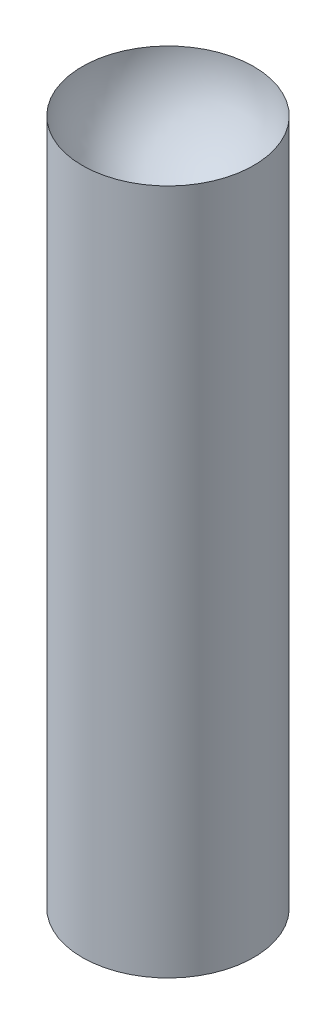
ISO-10303-21;
HEADER;
FILE_DESCRIPTION(('STEP AP214'),'2;1');
FILE_NAME('part.step','',(''),(''),'','','');
FILE_SCHEMA(('AUTOMOTIVE_DESIGN { 1 0 10303 214 1 1 1 1 }'));
ENDSEC;
DATA;
#1=APPLICATION_CONTEXT('core data for automotive mechanical design processes');
#2=APPLICATION_PROTOCOL_DEFINITION('international standard','automotive_design',2000,#1);
#3=PRODUCT_CONTEXT('',#1,'mechanical');
#4=PRODUCT('Part','Part','',(#3));
#5=PRODUCT_RELATED_PRODUCT_CATEGORY('part','',(#4));
#6=PRODUCT_DEFINITION_FORMATION('','',#4);
#7=PRODUCT_DEFINITION_CONTEXT('part definition',#1,'design');
#8=PRODUCT_DEFINITION('design','',#6,#7);
#9=PRODUCT_DEFINITION_SHAPE('','',#8);
#10=(LENGTH_UNIT() NAMED_UNIT(*) SI_UNIT(.MILLI.,.METRE.));
#11=(NAMED_UNIT(*) PLANE_ANGLE_UNIT() SI_UNIT($,.RADIAN.));
#12=(NAMED_UNIT(*) SI_UNIT($,.STERADIAN.) SOLID_ANGLE_UNIT());
#13=UNCERTAINTY_MEASURE_WITH_UNIT(LENGTH_MEASURE(1.E-05),#10,'distance_accuracy_value','');
#14=(GEOMETRIC_REPRESENTATION_CONTEXT(3) GLOBAL_UNCERTAINTY_ASSIGNED_CONTEXT((#13)) GLOBAL_UNIT_ASSIGNED_CONTEXT((#10,
#11,#12)) REPRESENTATION_CONTEXT('',''));
#15=CARTESIAN_POINT('',(0.,0.,0.));
#16=DIRECTION('',(0.,0.,1.));
#17=DIRECTION('',(1.,0.,0.));
#18=AXIS2_PLACEMENT_3D('',#15,#16,#17);
#19=CARTESIAN_POINT('',(0.,101.6,0.));
#20=DIRECTION('',(0.,-1.,0.));
#21=DIRECTION('',(0.,0.,-1.));
#22=AXIS2_PLACEMENT_3D('',#19,#20,#21);
#23=CYLINDRICAL_SURFACE('',#22,12.7);
#24=CARTESIAN_POINT('',(0.,101.6,0.));
#25=DIRECTION('',(0.,1.,0.));
#26=DIRECTION('',(0.,0.,1.));
#27=AXIS2_PLACEMENT_3D('',#24,#25,#26);
#28=CIRCLE('',#27,12.7);
#29=CARTESIAN_POINT('',(0.,101.6,12.7));
#30=VERTEX_POINT('',#29);
#31=EDGE_CURVE('E38',#30,#30,#28,.F.);
#32=ORIENTED_EDGE('',*,*,#31,.T.);
#33=EDGE_LOOP('',(#32));
#34=FACE_BOUND('',#33,.T.);
#35=CARTESIAN_POINT('',(0.,0.,0.));
#36=DIRECTION('',(0.,1.,0.));
#37=DIRECTION('',(0.,0.,1.));
#38=AXIS2_PLACEMENT_3D('',#35,#36,#37);
#39=CIRCLE('',#38,12.7);
#40=CARTESIAN_POINT('',(0.,0.,12.7));
#41=VERTEX_POINT('',#40);
#42=EDGE_CURVE('E10',#41,#41,#39,.T.);
#43=ORIENTED_EDGE('',*,*,#42,.T.);
#44=EDGE_LOOP('',(#43));
#45=FACE_BOUND('',#44,.T.);
#46=ADVANCED_FACE('F31',(#34,#45),#23,.T.);
#47=CARTESIAN_POINT('',(0.,0.,0.));
#48=DIRECTION('',(0.,1.,0.));
#49=DIRECTION('',(0.,0.,1.));
#50=AXIS2_PLACEMENT_3D('',#47,#48,#49);
#51=PLANE('',#50);
#52=CARTESIAN_POINT('',(0.,0.,0.));
#53=DIRECTION('',(0.,1.,0.));
#54=DIRECTION('',(0.,0.,1.));
#55=AXIS2_PLACEMENT_3D('',#52,#53,#54);
#56=CIRCLE('',#55,10.16);
#57=CARTESIAN_POINT('',(0.,0.,10.16));
#58=VERTEX_POINT('',#57);
#59=EDGE_CURVE('E34',#58,#58,#56,.F.);
#60=ORIENTED_EDGE('',*,*,#59,.F.);
#61=EDGE_LOOP('',(#60));
#62=FACE_BOUND('',#61,.T.);
#63=ORIENTED_EDGE('',*,*,#42,.F.);
#64=EDGE_LOOP('',(#63));
#65=FACE_BOUND('',#64,.T.);
#66=ADVANCED_FACE('F50',(#62,#65),#51,.F.);
#67=CARTESIAN_POINT('',(0.,101.6,0.));
#68=DIRECTION('',(0.,0.,-1.));
#69=DIRECTION('',(1.,0.,0.));
#70=AXIS2_PLACEMENT_3D('',#67,#68,#69);
#71=SPHERICAL_SURFACE('',#70,12.7);
#72=CARTESIAN_POINT('',(0.,101.6,0.));
#73=DIRECTION('',(0.,1.,0.));
#74=DIRECTION('',(0.,0.,1.));
#75=AXIS2_PLACEMENT_3D('',#72,#73,#74);
#76=SPHERICAL_SURFACE('',#75,12.7);
#77=ORIENTED_EDGE('',*,*,#31,.F.);
#78=EDGE_LOOP('',(#77));
#79=FACE_BOUND('',#78,.T.);
#80=ADVANCED_FACE('F53',(#79),#76,.F.);
#81=CARTESIAN_POINT('',(0.,0.,0.));
#82=DIRECTION('',(0.,0.,1.));
#83=DIRECTION('',(1.,0.,0.));
#84=AXIS2_PLACEMENT_3D('',#81,#82,#83);
#85=SPHERICAL_SURFACE('',#84,10.16);
#86=CARTESIAN_POINT('',(0.,0.,0.));
#87=DIRECTION('',(0.,1.,0.));
#88=DIRECTION('',(0.,0.,1.));
#89=AXIS2_PLACEMENT_3D('',#86,#87,#88);
#90=SPHERICAL_SURFACE('',#89,10.16);
#91=ORIENTED_EDGE('',*,*,#59,.T.);
#92=EDGE_LOOP('',(#91));
#93=FACE_BOUND('',#92,.T.);
#94=ADVANCED_FACE('F48',(#93),#90,.F.);
#95=CLOSED_SHELL('',(#46,#66,#80,#94));
#96=MANIFOLD_SOLID_BREP('B2',#95);
#97=ADVANCED_BREP_SHAPE_REPRESENTATION('',(#18,#96),#14);
#98=SHAPE_DEFINITION_REPRESENTATION(#9,#97);
ENDSEC;
END-ISO-10303-21;
